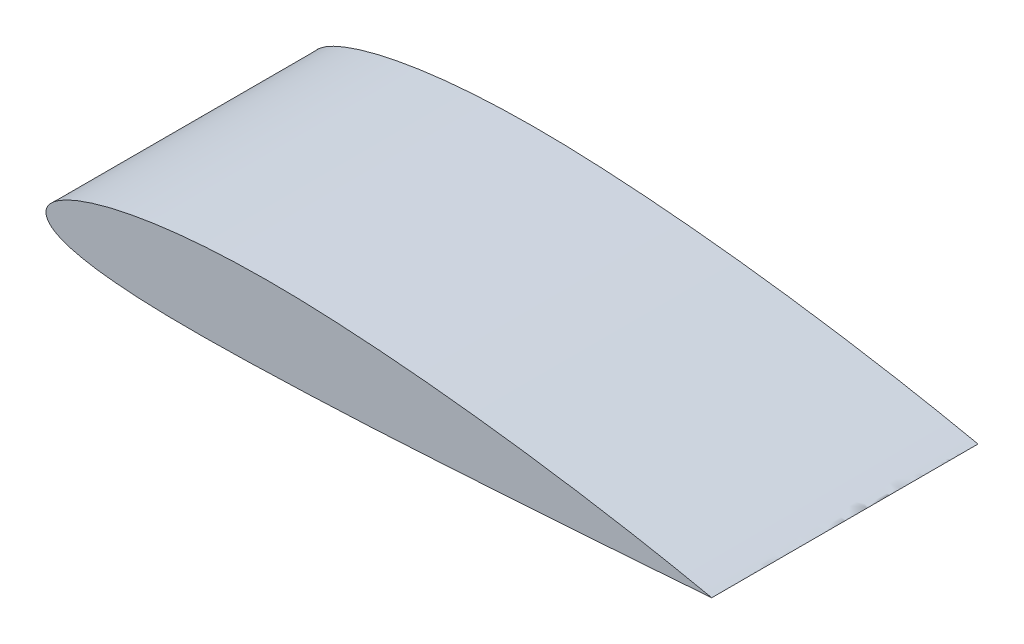
ISO-10303-21;
HEADER;
FILE_DESCRIPTION(('STEP AP214'),'2;1');
FILE_NAME('part.step','',(''),(''),'','','');
FILE_SCHEMA(('AUTOMOTIVE_DESIGN { 1 0 10303 214 1 1 1 1 }'));
ENDSEC;
DATA;
#1=APPLICATION_CONTEXT('core data for automotive mechanical design processes');
#2=APPLICATION_PROTOCOL_DEFINITION('international standard','automotive_design',2000,#1);
#3=PRODUCT_CONTEXT('',#1,'mechanical');
#4=PRODUCT('Part','Part','',(#3));
#5=PRODUCT_RELATED_PRODUCT_CATEGORY('part','',(#4));
#6=PRODUCT_DEFINITION_FORMATION('','',#4);
#7=PRODUCT_DEFINITION_CONTEXT('part definition',#1,'design');
#8=PRODUCT_DEFINITION('design','',#6,#7);
#9=PRODUCT_DEFINITION_SHAPE('','',#8);
#10=(LENGTH_UNIT() NAMED_UNIT(*) SI_UNIT(.MILLI.,.METRE.));
#11=(NAMED_UNIT(*) PLANE_ANGLE_UNIT() SI_UNIT($,.RADIAN.));
#12=(NAMED_UNIT(*) SI_UNIT($,.STERADIAN.) SOLID_ANGLE_UNIT());
#13=UNCERTAINTY_MEASURE_WITH_UNIT(LENGTH_MEASURE(1.E-05),#10,'distance_accuracy_value','');
#14=(GEOMETRIC_REPRESENTATION_CONTEXT(3) GLOBAL_UNCERTAINTY_ASSIGNED_CONTEXT((#13)) GLOBAL_UNIT_ASSIGNED_CONTEXT((#10,
#11,#12)) REPRESENTATION_CONTEXT('',''));
#15=CARTESIAN_POINT('',(0.,0.,0.));
#16=DIRECTION('',(0.,0.,1.));
#17=DIRECTION('',(1.,0.,0.));
#18=AXIS2_PLACEMENT_3D('',#15,#16,#17);
#19=CARTESIAN_POINT('',(75.,0.,30.));
#20=CARTESIAN_POINT('',(75.000368964813,0.00559027238283835,30.));
#21=CARTESIAN_POINT('',(74.7542692984072,0.0443956654816815,30.));
#22=CARTESIAN_POINT('',(74.5024862623003,0.111131935241673,30.));
#23=CARTESIAN_POINT('',(73.8833042711477,0.234072142947051,30.));
#24=CARTESIAN_POINT('',(73.1152341851971,0.396993751141279,30.));
#25=CARTESIAN_POINT('',(72.0980284301548,0.603568088825038,30.));
#26=CARTESIAN_POINT('',(70.8804140231112,0.847362855877144,30.));
#27=CARTESIAN_POINT('',(69.4536292825402,1.12497230342777,30.));
#28=CARTESIAN_POINT('',(67.8315930019561,1.43150489335527,30.));
#29=CARTESIAN_POINT('',(66.0220151818574,1.76184450581931,30.));
#30=CARTESIAN_POINT('',(64.0362216377003,2.11062344767,30.));
#31=CARTESIAN_POINT('',(61.8859176267749,2.47265701971903,30.));
#32=CARTESIAN_POINT('',(59.5840137881269,2.84221275424602,30.));
#33=CARTESIAN_POINT('',(57.1444319994363,3.21386664791326,30.));
#34=CARTESIAN_POINT('',(54.581949120928,3.58233779925885,30.));
#35=CARTESIAN_POINT('',(51.912150913858,3.94200160486005,30.));
#36=CARTESIAN_POINT('',(49.1513456864339,4.28779623233476,30.));
#37=CARTESIAN_POINT('',(46.3165338258654,4.61437159373769,30.));
#38=CARTESIAN_POINT('',(43.425172631071,4.91673106573299,30.));
#39=CARTESIAN_POINT('',(40.4952009300886,5.1898988068326,30.));
#40=CARTESIAN_POINT('',(37.5448391163051,5.42912000247147,30.));
#41=CARTESIAN_POINT('',(34.5925371208298,5.62983134128373,30.));
#42=CARTESIAN_POINT('',(31.6534616013253,5.7879724930063,30.));
#43=CARTESIAN_POINT('',(28.7416927354441,5.90135810018921,30.));
#44=CARTESIAN_POINT('',(25.8751928067306,5.94927045357433,30.));
#45=CARTESIAN_POINT('',(23.0762424141287,5.93164464340196,30.));
#46=CARTESIAN_POINT('',(20.3676107835032,5.84779149520762,30.));
#47=CARTESIAN_POINT('',(17.7671974058849,5.69904010458337,30.));
#48=CARTESIAN_POINT('',(15.2922055252031,5.48752179338794,30.));
#49=CARTESIAN_POINT('',(12.9588947131874,5.21700151923218,30.));
#50=CARTESIAN_POINT('',(10.7824786666679,4.89194781748949,30.));
#51=CARTESIAN_POINT('',(8.7769262495074,4.51826940097126,30.));
#52=CARTESIAN_POINT('',(6.95487116326809,4.10238720961359,30.));
#53=CARTESIAN_POINT('',(5.32742411156519,3.65150470410064,30.));
#54=CARTESIAN_POINT('',(3.90414637430819,3.17275348453326,30.));
#55=CARTESIAN_POINT('',(2.69257716591807,2.67369988968163,30.));
#56=CARTESIAN_POINT('',(1.69836377711601,2.16099559491095,30.));
#57=CARTESIAN_POINT('',(0.923985589681855,1.63972786632741,30.));
#58=CARTESIAN_POINT('',(0.369883305445428,1.11098489627091,30.));
#59=CARTESIAN_POINT('',(0.0364142029801129,0.564253170793422,30.));
#60=CARTESIAN_POINT('',(-0.0427602445421368,-0.00428281316242509,30.));
#61=CARTESIAN_POINT('',(0.147182435568882,-0.545399650647642,30.));
#62=CARTESIAN_POINT('',(0.5788284821979,-1.01583668241004,30.));
#63=CARTESIAN_POINT('',(1.21927433278317,-1.42775606370304,30.));
#64=CARTESIAN_POINT('',(2.06831076143945,-1.79454199586555,30.));
#65=CARTESIAN_POINT('',(3.12451715987273,-2.11806684800643,30.));
#66=CARTESIAN_POINT('',(4.38347156966372,-2.39869472678432,30.));
#67=CARTESIAN_POINT('',(5.83829046926485,-2.63571466734098,30.));
#68=CARTESIAN_POINT('',(7.48041321484125,-2.82890199285417,30.));
#69=CARTESIAN_POINT('',(9.29998517433779,-2.97861823696784,30.));
#70=CARTESIAN_POINT('',(11.2861667355959,-3.08590737664646,30.));
#71=CARTESIAN_POINT('',(13.427244841429,-3.15290326716662,30.));
#72=CARTESIAN_POINT('',(15.7107582281141,-3.1817936893964,30.));
#73=CARTESIAN_POINT('',(18.1235473798772,-3.17638166801569,30.));
#74=CARTESIAN_POINT('',(20.6518028475949,-3.14038525272528,30.));
#75=CARTESIAN_POINT('',(23.2811277780909,-3.07852094967604,30.));
#76=CARTESIAN_POINT('',(25.9965513666777,-2.99574240836147,30.));
#77=CARTESIAN_POINT('',(28.7869272754354,-2.89668810884312,30.));
#78=CARTESIAN_POINT('',(31.6395158591695,-2.78784240065752,30.));
#79=CARTESIAN_POINT('',(34.5367851660808,-2.65639055787652,30.));
#80=CARTESIAN_POINT('',(37.4569391469348,-2.50813613890999,30.));
#81=CARTESIAN_POINT('',(40.3789864091376,-2.34698430239596,30.));
#82=CARTESIAN_POINT('',(43.2851542812371,-2.17670258849074,30.));
#83=CARTESIAN_POINT('',(46.1577311329763,-2.00083597586722,30.));
#84=CARTESIAN_POINT('',(48.9791235607259,-1.82241813472057,30.));
#85=CARTESIAN_POINT('',(51.7319071940582,-1.64368679149248,30.));
#86=CARTESIAN_POINT('',(54.3990987611369,-1.46745585458462,30.));
#87=CARTESIAN_POINT('',(56.9640507290492,-1.29497177267714,30.));
#88=CARTESIAN_POINT('',(59.4108265536047,-1.12835694677883,30.));
#89=CARTESIAN_POINT('',(61.7240411271002,-0.96863387083364,30.));
#90=CARTESIAN_POINT('',(63.8891478583775,-0.817253335434557,30.));
#91=CARTESIAN_POINT('',(65.8923933768636,-0.675433345863826,30.));
#92=CARTESIAN_POINT('',(67.7211894599668,-0.544086360937074,30.));
#93=CARTESIAN_POINT('',(69.3633002756539,-0.424604566640176,30.));
#94=CARTESIAN_POINT('',(70.8099823815737,-0.318065006996849,30.));
#95=CARTESIAN_POINT('',(72.0464377592448,-0.22519120145078,30.));
#96=CARTESIAN_POINT('',(73.0804738221407,-0.148318957533525,30.));
#97=CARTESIAN_POINT('',(73.8625812104288,-0.085530055759821,30.));
#98=CARTESIAN_POINT('',(74.4922270125237,-0.0443238583623437,30.));
#99=CARTESIAN_POINT('',(74.7505435042176,-0.011447152327888,30.));
#100=CARTESIAN_POINT('',(74.9996309726867,-0.00559121933869818,30.));
#101=CARTESIAN_POINT('',(75.,0.,30.));
#102=B_SPLINE_CURVE_WITH_KNOTS('',3,(#19,#20,#21,#22,#23,#24,#25,#26,#27,#28,#29,#30,#31,#32,
#33,#34,#35,#36,#37,#38,#39,#40,#41,#42,#43,#44,#45,#46,#47,#48,#49,#50,#51,#52,#53,#54,#55,#56,
#57,#58,#59,#60,#61,#62,#63,#64,#65,#66,#67,#68,#69,#70,#71,#72,#73,#74,#75,#76,#77,#78,#79,#80,
#81,#82,#83,#84,#85,#86,#87,#88,#89,#90,#91,#92,#93,#94,#95,#96,#97,#98,#99,#100,#101),
.UNSPECIFIED.,.T.,.F.,(4,1,1,1,1,1,1,1,1,1,1,1,1,1,1,1,1,1,1,1,1,1,1,1,1,1,1,1,1,1,1,1,1,1,1,1,
1,1,1,1,1,1,1,1,1,1,1,1,1,1,1,1,1,1,1,1,1,1,1,1,1,1,1,1,1,1,1,1,1,1,1,1,1,1,1,1,1,1,1,1,4),(0.,
0.000764398389835713,0.00305362716070761,0.00685271934488322,0.0121372995198765,
0.018875035533948,0.0270227341041185,0.0365293703056965,0.0473360342446872,0.0593747317574161,
0.0725708053229684,0.0868426354970006,0.102101325606023,0.118252657688996,0.135196036403175,
0.152827755392361,0.171037897234481,0.189714525168863,0.208740930618524,0.228000541525308,
0.247373574121448,0.266740076345624,0.285981130279328,0.30504492173417,0.323834702989135,
0.342151576600036,0.359885004568401,0.376928716231848,0.393182463591822,0.408551189509315,
0.422947486875618,0.436292855103365,0.448515763838188,0.459556870464295,0.469369557387397,
0.477922568405815,0.485208303078488,0.491254683225012,0.496154304650351,0.500119333660576,
0.503572697274651,0.507025603665317,0.510984497925778,0.515859933775993,0.521855235014424,
0.529053235395791,0.537475869358648,0.54711075352789,0.557923557187576,0.569866129270282,
0.58287908408271,0.596894467463304,0.611837126022708,0.627624939216132,0.64417063399298,
0.661381164872423,0.679159006594662,0.697402435406586,0.716091603847442,0.735094519178476,
0.754230967981993,0.773384114336448,0.792437477931653,0.811273507136751,0.82977620938016,
0.847831696414227,0.865326528323244,0.882152483341294,0.898204195954859,0.91338092395911,
0.927586775905536,0.940731789725915,0.9527324238513,0.963511381975241,0.97299977641869,
0.98113600882803,0.987867232023209,0.993149044746965,0.99694639766101,0.999235472126038,1.),.UNSPECIFIED.);
#103=DIRECTION('',(0.,0.,-1.));
#104=VECTOR('',#103,1.);
#105=SURFACE_OF_LINEAR_EXTRUSION('',#102,#104);
#106=CARTESIAN_POINT('',(75.,0.,30.));
#107=VERTEX_POINT('',#106);
#108=EDGE_CURVE('E10',#107,#107,#102,.T.);
#109=ORIENTED_EDGE('',*,*,#108,.F.);
#110=EDGE_LOOP('',(#109));
#111=FACE_BOUND('',#110,.T.);
#112=CARTESIAN_POINT('',(75.,0.,0.));
#113=CARTESIAN_POINT('',(75.000368964813,0.00559027238283835,0.));
#114=CARTESIAN_POINT('',(74.7542692984072,0.0443956654816815,0.));
#115=CARTESIAN_POINT('',(74.5024862623003,0.111131935241673,0.));
#116=CARTESIAN_POINT('',(73.8833042711477,0.234072142947051,0.));
#117=CARTESIAN_POINT('',(73.1152341851971,0.396993751141279,0.));
#118=CARTESIAN_POINT('',(72.0980284301548,0.603568088825038,0.));
#119=CARTESIAN_POINT('',(70.8804140231112,0.847362855877144,0.));
#120=CARTESIAN_POINT('',(69.4536292825402,1.12497230342777,0.));
#121=CARTESIAN_POINT('',(67.8315930019561,1.43150489335527,0.));
#122=CARTESIAN_POINT('',(66.0220151818574,1.76184450581931,0.));
#123=CARTESIAN_POINT('',(64.0362216377003,2.11062344767,0.));
#124=CARTESIAN_POINT('',(61.8859176267749,2.47265701971903,0.));
#125=CARTESIAN_POINT('',(59.5840137881269,2.84221275424602,0.));
#126=CARTESIAN_POINT('',(57.1444319994363,3.21386664791326,0.));
#127=CARTESIAN_POINT('',(54.581949120928,3.58233779925885,0.));
#128=CARTESIAN_POINT('',(51.912150913858,3.94200160486005,0.));
#129=CARTESIAN_POINT('',(49.1513456864339,4.28779623233476,0.));
#130=CARTESIAN_POINT('',(46.3165338258654,4.61437159373769,0.));
#131=CARTESIAN_POINT('',(43.425172631071,4.91673106573299,0.));
#132=CARTESIAN_POINT('',(40.4952009300886,5.1898988068326,0.));
#133=CARTESIAN_POINT('',(37.5448391163051,5.42912000247147,0.));
#134=CARTESIAN_POINT('',(34.5925371208298,5.62983134128373,0.));
#135=CARTESIAN_POINT('',(31.6534616013253,5.7879724930063,0.));
#136=CARTESIAN_POINT('',(28.7416927354441,5.90135810018921,0.));
#137=CARTESIAN_POINT('',(25.8751928067306,5.94927045357433,0.));
#138=CARTESIAN_POINT('',(23.0762424141287,5.93164464340196,0.));
#139=CARTESIAN_POINT('',(20.3676107835032,5.84779149520762,0.));
#140=CARTESIAN_POINT('',(17.7671974058849,5.69904010458337,0.));
#141=CARTESIAN_POINT('',(15.2922055252031,5.48752179338794,0.));
#142=CARTESIAN_POINT('',(12.9588947131874,5.21700151923218,0.));
#143=CARTESIAN_POINT('',(10.7824786666679,4.89194781748949,0.));
#144=CARTESIAN_POINT('',(8.7769262495074,4.51826940097126,0.));
#145=CARTESIAN_POINT('',(6.95487116326809,4.10238720961359,0.));
#146=CARTESIAN_POINT('',(5.32742411156519,3.65150470410064,0.));
#147=CARTESIAN_POINT('',(3.90414637430819,3.17275348453326,0.));
#148=CARTESIAN_POINT('',(2.69257716591807,2.67369988968163,0.));
#149=CARTESIAN_POINT('',(1.69836377711601,2.16099559491095,0.));
#150=CARTESIAN_POINT('',(0.923985589681855,1.63972786632741,0.));
#151=CARTESIAN_POINT('',(0.369883305445428,1.11098489627091,0.));
#152=CARTESIAN_POINT('',(0.0364142029801129,0.564253170793422,0.));
#153=CARTESIAN_POINT('',(-0.0427602445421368,-0.00428281316242509,0.));
#154=CARTESIAN_POINT('',(0.147182435568882,-0.545399650647642,0.));
#155=CARTESIAN_POINT('',(0.5788284821979,-1.01583668241004,0.));
#156=CARTESIAN_POINT('',(1.21927433278317,-1.42775606370304,0.));
#157=CARTESIAN_POINT('',(2.06831076143945,-1.79454199586555,0.));
#158=CARTESIAN_POINT('',(3.12451715987273,-2.11806684800643,0.));
#159=CARTESIAN_POINT('',(4.38347156966372,-2.39869472678432,0.));
#160=CARTESIAN_POINT('',(5.83829046926485,-2.63571466734098,0.));
#161=CARTESIAN_POINT('',(7.48041321484125,-2.82890199285417,0.));
#162=CARTESIAN_POINT('',(9.29998517433779,-2.97861823696784,0.));
#163=CARTESIAN_POINT('',(11.2861667355959,-3.08590737664646,0.));
#164=CARTESIAN_POINT('',(13.427244841429,-3.15290326716662,0.));
#165=CARTESIAN_POINT('',(15.7107582281141,-3.1817936893964,0.));
#166=CARTESIAN_POINT('',(18.1235473798772,-3.17638166801569,0.));
#167=CARTESIAN_POINT('',(20.6518028475949,-3.14038525272528,0.));
#168=CARTESIAN_POINT('',(23.2811277780909,-3.07852094967604,0.));
#169=CARTESIAN_POINT('',(25.9965513666777,-2.99574240836147,0.));
#170=CARTESIAN_POINT('',(28.7869272754354,-2.89668810884312,0.));
#171=CARTESIAN_POINT('',(31.6395158591695,-2.78784240065752,0.));
#172=CARTESIAN_POINT('',(34.5367851660808,-2.65639055787652,0.));
#173=CARTESIAN_POINT('',(37.4569391469348,-2.50813613890999,0.));
#174=CARTESIAN_POINT('',(40.3789864091376,-2.34698430239596,0.));
#175=CARTESIAN_POINT('',(43.2851542812371,-2.17670258849074,0.));
#176=CARTESIAN_POINT('',(46.1577311329763,-2.00083597586722,0.));
#177=CARTESIAN_POINT('',(48.9791235607259,-1.82241813472057,0.));
#178=CARTESIAN_POINT('',(51.7319071940582,-1.64368679149248,0.));
#179=CARTESIAN_POINT('',(54.3990987611369,-1.46745585458462,0.));
#180=CARTESIAN_POINT('',(56.9640507290492,-1.29497177267714,0.));
#181=CARTESIAN_POINT('',(59.4108265536047,-1.12835694677883,0.));
#182=CARTESIAN_POINT('',(61.7240411271002,-0.96863387083364,0.));
#183=CARTESIAN_POINT('',(63.8891478583775,-0.817253335434557,0.));
#184=CARTESIAN_POINT('',(65.8923933768636,-0.675433345863826,0.));
#185=CARTESIAN_POINT('',(67.7211894599668,-0.544086360937074,0.));
#186=CARTESIAN_POINT('',(69.3633002756539,-0.424604566640176,0.));
#187=CARTESIAN_POINT('',(70.8099823815737,-0.318065006996849,0.));
#188=CARTESIAN_POINT('',(72.0464377592448,-0.22519120145078,0.));
#189=CARTESIAN_POINT('',(73.0804738221407,-0.148318957533525,0.));
#190=CARTESIAN_POINT('',(73.8625812104288,-0.085530055759821,0.));
#191=CARTESIAN_POINT('',(74.4922270125237,-0.0443238583623437,0.));
#192=CARTESIAN_POINT('',(74.7505435042176,-0.011447152327888,0.));
#193=CARTESIAN_POINT('',(74.9996309726867,-0.00559121933869818,0.));
#194=CARTESIAN_POINT('',(75.,0.,0.));
#195=B_SPLINE_CURVE_WITH_KNOTS('',3,(#112,#113,#114,#115,#116,#117,#118,#119,#120,#121,#122,
#123,#124,#125,#126,#127,#128,#129,#130,#131,#132,#133,#134,#135,#136,#137,#138,#139,#140,#141,
#142,#143,#144,#145,#146,#147,#148,#149,#150,#151,#152,#153,#154,#155,#156,#157,#158,#159,#160,
#161,#162,#163,#164,#165,#166,#167,#168,#169,#170,#171,#172,#173,#174,#175,#176,#177,#178,#179,
#180,#181,#182,#183,#184,#185,#186,#187,#188,#189,#190,#191,#192,#193,#194),.UNSPECIFIED.,.T.,
.F.,(4,1,1,1,1,1,1,1,1,1,1,1,1,1,1,1,1,1,1,1,1,1,1,1,1,1,1,1,1,1,1,1,1,1,1,1,1,1,1,1,1,1,1,1,1,
1,1,1,1,1,1,1,1,1,1,1,1,1,1,1,1,1,1,1,1,1,1,1,1,1,1,1,1,1,1,1,1,1,1,1,4),(0.,
0.000764398389835713,0.00305362716070761,0.00685271934488322,0.0121372995198765,
0.018875035533948,0.0270227341041185,0.0365293703056965,0.0473360342446872,0.0593747317574161,
0.0725708053229684,0.0868426354970006,0.102101325606023,0.118252657688996,0.135196036403175,
0.152827755392361,0.171037897234481,0.189714525168863,0.208740930618524,0.228000541525308,
0.247373574121448,0.266740076345624,0.285981130279328,0.30504492173417,0.323834702989135,
0.342151576600036,0.359885004568401,0.376928716231848,0.393182463591822,0.408551189509315,
0.422947486875618,0.436292855103365,0.448515763838188,0.459556870464295,0.469369557387397,
0.477922568405815,0.485208303078488,0.491254683225012,0.496154304650351,0.500119333660576,
0.503572697274651,0.507025603665317,0.510984497925778,0.515859933775993,0.521855235014424,
0.529053235395791,0.537475869358648,0.54711075352789,0.557923557187576,0.569866129270282,
0.58287908408271,0.596894467463304,0.611837126022708,0.627624939216132,0.64417063399298,
0.661381164872423,0.679159006594662,0.697402435406586,0.716091603847442,0.735094519178476,
0.754230967981993,0.773384114336448,0.792437477931653,0.811273507136751,0.82977620938016,
0.847831696414227,0.865326528323244,0.882152483341294,0.898204195954859,0.91338092395911,
0.927586775905536,0.940731789725915,0.9527324238513,0.963511381975241,0.97299977641869,
0.98113600882803,0.987867232023209,0.993149044746965,0.99694639766101,0.999235472126038,1.),.UNSPECIFIED.);
#196=CARTESIAN_POINT('',(75.,0.,0.));
#197=VERTEX_POINT('',#196);
#198=EDGE_CURVE('E35',#197,#197,#195,.T.);
#199=ORIENTED_EDGE('',*,*,#198,.T.);
#200=EDGE_LOOP('',(#199));
#201=FACE_BOUND('',#200,.T.);
#202=ADVANCED_FACE('F31',(#111,#201),#105,.F.);
#203=CARTESIAN_POINT('',(0.0705184720204074,0.54213321698284,30.));
#204=DIRECTION('',(0.,0.,-1.));
#205=DIRECTION('',(-1.,0.,0.));
#206=AXIS2_PLACEMENT_3D('',#203,#204,#205);
#207=PLANE('',#206);
#208=ORIENTED_EDGE('',*,*,#108,.T.);
#209=EDGE_LOOP('',(#208));
#210=FACE_BOUND('',#209,.T.);
#211=ADVANCED_FACE('F54',(#210),#207,.F.);
#212=CARTESIAN_POINT('',(0.0705184720204074,0.54213321698284,0.));
#213=DIRECTION('',(0.,0.,-1.));
#214=DIRECTION('',(-1.,0.,0.));
#215=AXIS2_PLACEMENT_3D('',#212,#213,#214);
#216=PLANE('',#215);
#217=ORIENTED_EDGE('',*,*,#198,.F.);
#218=EDGE_LOOP('',(#217));
#219=FACE_BOUND('',#218,.T.);
#220=ADVANCED_FACE('F52',(#219),#216,.T.);
#221=CLOSED_SHELL('',(#202,#211,#220));
#222=MANIFOLD_SOLID_BREP('B2',#221);
#223=ADVANCED_BREP_SHAPE_REPRESENTATION('',(#18,#222),#14);
#224=SHAPE_DEFINITION_REPRESENTATION(#9,#223);
ENDSEC;
END-ISO-10303-21;
